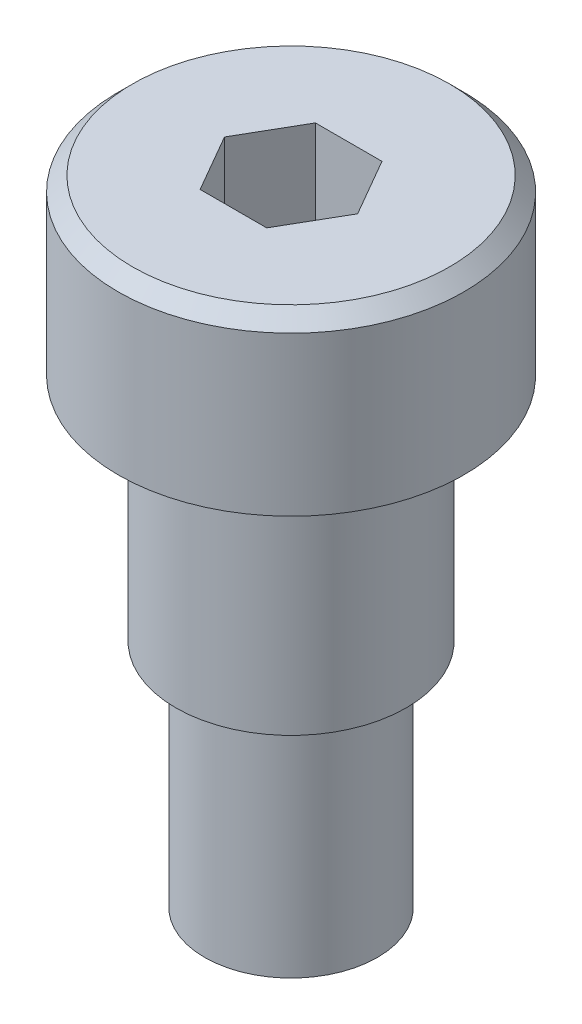
ISO-10303-21;
HEADER;
FILE_DESCRIPTION(('STEP AP214'),'2;1');
FILE_NAME('part.step','',(''),(''),'','','');
FILE_SCHEMA(('AUTOMOTIVE_DESIGN { 1 0 10303 214 1 1 1 1 }'));
ENDSEC;
DATA;
#1=APPLICATION_CONTEXT('core data for automotive mechanical design processes');
#2=APPLICATION_PROTOCOL_DEFINITION('international standard','automotive_design',2000,#1);
#3=PRODUCT_CONTEXT('',#1,'mechanical');
#4=PRODUCT('Part','Part','',(#3));
#5=PRODUCT_RELATED_PRODUCT_CATEGORY('part','',(#4));
#6=PRODUCT_DEFINITION_FORMATION('','',#4);
#7=PRODUCT_DEFINITION_CONTEXT('part definition',#1,'design');
#8=PRODUCT_DEFINITION('design','',#6,#7);
#9=PRODUCT_DEFINITION_SHAPE('','',#8);
#10=(LENGTH_UNIT() NAMED_UNIT(*) SI_UNIT(.MILLI.,.METRE.));
#11=(NAMED_UNIT(*) PLANE_ANGLE_UNIT() SI_UNIT($,.RADIAN.));
#12=(NAMED_UNIT(*) SI_UNIT($,.STERADIAN.) SOLID_ANGLE_UNIT());
#13=UNCERTAINTY_MEASURE_WITH_UNIT(LENGTH_MEASURE(1.E-05),#10,'distance_accuracy_value','');
#14=(GEOMETRIC_REPRESENTATION_CONTEXT(3) GLOBAL_UNCERTAINTY_ASSIGNED_CONTEXT((#13)) GLOBAL_UNIT_ASSIGNED_CONTEXT((#10,
#11,#12)) REPRESENTATION_CONTEXT('',''));
#15=CARTESIAN_POINT('',(0.,0.,0.));
#16=DIRECTION('',(0.,0.,1.));
#17=DIRECTION('',(1.,0.,0.));
#18=AXIS2_PLACEMENT_3D('',#15,#16,#17);
#19=CARTESIAN_POINT('',(0.,3.,0.));
#20=DIRECTION('',(0.,-1.,0.));
#21=DIRECTION('',(0.,0.,-1.));
#22=AXIS2_PLACEMENT_3D('',#19,#20,#21);
#23=CYLINDRICAL_SURFACE('',#22,3.);
#24=CARTESIAN_POINT('',(0.,2.75,0.));
#25=DIRECTION('',(0.,1.,0.));
#26=DIRECTION('',(0.,0.,1.));
#27=AXIS2_PLACEMENT_3D('',#24,#25,#26);
#28=CIRCLE('',#27,3.);
#29=CARTESIAN_POINT('',(0.,2.75,3.));
#30=VERTEX_POINT('',#29);
#31=EDGE_CURVE('E11',#30,#30,#28,.F.);
#32=ORIENTED_EDGE('',*,*,#31,.T.);
#33=EDGE_LOOP('',(#32));
#34=FACE_BOUND('',#33,.T.);
#35=CARTESIAN_POINT('',(0.,0.,0.));
#36=DIRECTION('',(0.,1.,0.));
#37=DIRECTION('',(0.,0.,1.));
#38=AXIS2_PLACEMENT_3D('',#35,#36,#37);
#39=CIRCLE('',#38,3.);
#40=CARTESIAN_POINT('',(0.,0.,3.));
#41=VERTEX_POINT('',#40);
#42=EDGE_CURVE('E159',#41,#41,#39,.T.);
#43=ORIENTED_EDGE('',*,*,#42,.T.);
#44=EDGE_LOOP('',(#43));
#45=FACE_BOUND('',#44,.T.);
#46=ADVANCED_FACE('F43',(#34,#45),#23,.T.);
#47=CARTESIAN_POINT('',(0.,3.,0.));
#48=DIRECTION('',(0.,1.,0.));
#49=DIRECTION('',(0.,0.,1.));
#50=AXIS2_PLACEMENT_3D('',#47,#48,#49);
#51=PLANE('',#50);
#52=CARTESIAN_POINT('',(0.,3.,0.));
#53=DIRECTION('',(0.,1.,0.));
#54=DIRECTION('',(0.,0.,1.));
#55=AXIS2_PLACEMENT_3D('',#52,#53,#54);
#56=CIRCLE('',#55,2.75);
#57=CARTESIAN_POINT('',(0.,3.,2.75));
#58=VERTEX_POINT('',#57);
#59=EDGE_CURVE('E51',#58,#58,#56,.T.);
#60=ORIENTED_EDGE('',*,*,#59,.T.);
#61=EDGE_LOOP('',(#60));
#62=FACE_BOUND('',#61,.T.);
#63=DIRECTION('',(-0.5,0.,-0.866025403784439));
#64=VECTOR('',#63,1.);
#65=CARTESIAN_POINT('',(1.15470053837925,3.,0.));
#66=LINE('',#65,#64);
#67=CARTESIAN_POINT('',(1.15470053837925,3.,0.));
#68=VERTEX_POINT('',#67);
#69=CARTESIAN_POINT('',(0.577350269189626,3.,-1.));
#70=VERTEX_POINT('',#69);
#71=EDGE_CURVE('E58',#68,#70,#66,.T.);
#72=ORIENTED_EDGE('',*,*,#71,.F.);
#73=DIRECTION('',(0.5,0.,-0.866025403784439));
#74=VECTOR('',#73,1.);
#75=CARTESIAN_POINT('',(0.577350269189626,3.,1.));
#76=LINE('',#75,#74);
#77=CARTESIAN_POINT('',(0.577350269189626,3.,1.));
#78=VERTEX_POINT('',#77);
#79=EDGE_CURVE('E141',#78,#68,#76,.T.);
#80=ORIENTED_EDGE('',*,*,#79,.F.);
#81=DIRECTION('',(1.,0.,0.));
#82=VECTOR('',#81,1.);
#83=CARTESIAN_POINT('',(-0.577350269189625,3.,1.));
#84=LINE('',#83,#82);
#85=CARTESIAN_POINT('',(-0.577350269189625,3.,1.));
#86=VERTEX_POINT('',#85);
#87=EDGE_CURVE('E139',#86,#78,#84,.T.);
#88=ORIENTED_EDGE('',*,*,#87,.F.);
#89=DIRECTION('',(0.5,0.,0.866025403784439));
#90=VECTOR('',#89,1.);
#91=CARTESIAN_POINT('',(-1.15470053837925,3.,0.));
#92=LINE('',#91,#90);
#93=CARTESIAN_POINT('',(-1.15470053837925,3.,0.));
#94=VERTEX_POINT('',#93);
#95=EDGE_CURVE('E106',#94,#86,#92,.T.);
#96=ORIENTED_EDGE('',*,*,#95,.F.);
#97=DIRECTION('',(-0.5,0.,0.866025403784439));
#98=VECTOR('',#97,1.);
#99=CARTESIAN_POINT('',(-0.577350269189626,3.,-1.));
#100=LINE('',#99,#98);
#101=CARTESIAN_POINT('',(-0.577350269189626,3.,-1.));
#102=VERTEX_POINT('',#101);
#103=EDGE_CURVE('E135',#102,#94,#100,.T.);
#104=ORIENTED_EDGE('',*,*,#103,.F.);
#105=DIRECTION('',(-1.,0.,0.));
#106=VECTOR('',#105,1.);
#107=CARTESIAN_POINT('',(0.577350269189626,3.,-1.));
#108=LINE('',#107,#106);
#109=EDGE_CURVE('E132',#70,#102,#108,.T.);
#110=ORIENTED_EDGE('',*,*,#109,.F.);
#111=EDGE_LOOP('',(#72,#80,#88,#96,#104,#110));
#112=FACE_BOUND('',#111,.T.);
#113=ADVANCED_FACE('F167',(#62,#112),#51,.T.);
#114=CARTESIAN_POINT('',(0.,0.,0.));
#115=DIRECTION('',(0.,1.,0.));
#116=DIRECTION('',(0.,0.,1.));
#117=AXIS2_PLACEMENT_3D('',#114,#115,#116);
#118=PLANE('',#117);
#119=CARTESIAN_POINT('',(0.,0.,0.));
#120=DIRECTION('',(0.,1.,0.));
#121=DIRECTION('',(0.,0.,1.));
#122=AXIS2_PLACEMENT_3D('',#119,#120,#121);
#123=CIRCLE('',#122,2.);
#124=CARTESIAN_POINT('',(0.,0.,2.));
#125=VERTEX_POINT('',#124);
#126=EDGE_CURVE('E162',#125,#125,#123,.F.);
#127=ORIENTED_EDGE('',*,*,#126,.F.);
#128=EDGE_LOOP('',(#127));
#129=FACE_BOUND('',#128,.T.);
#130=ORIENTED_EDGE('',*,*,#42,.F.);
#131=EDGE_LOOP('',(#130));
#132=FACE_BOUND('',#131,.T.);
#133=ADVANCED_FACE('F184',(#129,#132),#118,.F.);
#134=CARTESIAN_POINT('',(0.,-4.,0.));
#135=DIRECTION('',(0.,1.,0.));
#136=DIRECTION('',(0.,0.,1.));
#137=AXIS2_PLACEMENT_3D('',#134,#135,#136);
#138=CYLINDRICAL_SURFACE('',#137,2.);
#139=CARTESIAN_POINT('',(0.,-4.,0.));
#140=DIRECTION('',(0.,-1.,0.));
#141=DIRECTION('',(0.,0.,-1.));
#142=AXIS2_PLACEMENT_3D('',#139,#140,#141);
#143=CIRCLE('',#142,2.);
#144=CARTESIAN_POINT('',(0.,-4.,-2.));
#145=VERTEX_POINT('',#144);
#146=EDGE_CURVE('E154',#145,#145,#143,.T.);
#147=ORIENTED_EDGE('',*,*,#146,.F.);
#148=EDGE_LOOP('',(#147));
#149=FACE_BOUND('',#148,.T.);
#150=ORIENTED_EDGE('',*,*,#126,.T.);
#151=EDGE_LOOP('',(#150));
#152=FACE_BOUND('',#151,.T.);
#153=ADVANCED_FACE('F189',(#149,#152),#138,.T.);
#154=CARTESIAN_POINT('',(0.,-4.,0.));
#155=DIRECTION('',(0.,-1.,0.));
#156=DIRECTION('',(0.,0.,-1.));
#157=AXIS2_PLACEMENT_3D('',#154,#155,#156);
#158=PLANE('',#157);
#159=CARTESIAN_POINT('',(0.,-4.,0.));
#160=DIRECTION('',(0.,-1.,0.));
#161=DIRECTION('',(0.,0.,-1.));
#162=AXIS2_PLACEMENT_3D('',#159,#160,#161);
#163=CIRCLE('',#162,1.5);
#164=CARTESIAN_POINT('',(0.,-4.,-1.5));
#165=VERTEX_POINT('',#164);
#166=EDGE_CURVE('E145',#165,#165,#163,.T.);
#167=ORIENTED_EDGE('',*,*,#166,.F.);
#168=EDGE_LOOP('',(#167));
#169=FACE_BOUND('',#168,.T.);
#170=ORIENTED_EDGE('',*,*,#146,.T.);
#171=EDGE_LOOP('',(#170));
#172=FACE_BOUND('',#171,.T.);
#173=ADVANCED_FACE('F194',(#169,#172),#158,.T.);
#174=CARTESIAN_POINT('',(0.,-8.,0.));
#175=DIRECTION('',(0.,1.,0.));
#176=DIRECTION('',(0.,0.,1.));
#177=AXIS2_PLACEMENT_3D('',#174,#175,#176);
#178=CYLINDRICAL_SURFACE('',#177,1.5);
#179=CARTESIAN_POINT('',(0.,-8.,0.));
#180=DIRECTION('',(0.,-1.,0.));
#181=DIRECTION('',(0.,0.,-1.));
#182=AXIS2_PLACEMENT_3D('',#179,#180,#181);
#183=CIRCLE('',#182,1.5);
#184=CARTESIAN_POINT('',(0.,-8.,-1.5));
#185=VERTEX_POINT('',#184);
#186=EDGE_CURVE('E151',#185,#185,#183,.T.);
#187=ORIENTED_EDGE('',*,*,#186,.F.);
#188=EDGE_LOOP('',(#187));
#189=FACE_BOUND('',#188,.T.);
#190=ORIENTED_EDGE('',*,*,#166,.T.);
#191=EDGE_LOOP('',(#190));
#192=FACE_BOUND('',#191,.T.);
#193=ADVANCED_FACE('F198',(#189,#192),#178,.T.);
#194=CARTESIAN_POINT('',(0.,-8.,0.));
#195=DIRECTION('',(0.,-1.,0.));
#196=DIRECTION('',(0.,0.,-1.));
#197=AXIS2_PLACEMENT_3D('',#194,#195,#196);
#198=PLANE('',#197);
#199=ORIENTED_EDGE('',*,*,#186,.T.);
#200=EDGE_LOOP('',(#199));
#201=FACE_BOUND('',#200,.T.);
#202=ADVANCED_FACE('F202',(#201),#198,.T.);
#203=CARTESIAN_POINT('',(1.15470053837925,1.,0.));
#204=DIRECTION('',(0.866025403784439,0.,-0.5));
#205=DIRECTION('',(-0.5,0.,-0.866025403784439));
#206=AXIS2_PLACEMENT_3D('',#203,#204,#205);
#207=PLANE('',#206);
#208=ORIENTED_EDGE('',*,*,#71,.T.);
#209=DIRECTION('',(0.,1.,0.));
#210=VECTOR('',#209,1.);
#211=CARTESIAN_POINT('',(0.577350269189626,1.,-1.));
#212=LINE('',#211,#210);
#213=CARTESIAN_POINT('',(0.577350269189626,1.,-1.));
#214=VERTEX_POINT('',#213);
#215=EDGE_CURVE('E88',#214,#70,#212,.T.);
#216=ORIENTED_EDGE('',*,*,#215,.F.);
#217=DIRECTION('',(-0.5,0.,-0.866025403784439));
#218=VECTOR('',#217,1.);
#219=CARTESIAN_POINT('',(1.15470053837925,1.,0.));
#220=LINE('',#219,#218);
#221=CARTESIAN_POINT('',(1.15470053837925,1.,0.));
#222=VERTEX_POINT('',#221);
#223=EDGE_CURVE('E143',#222,#214,#220,.T.);
#224=ORIENTED_EDGE('',*,*,#223,.F.);
#225=DIRECTION('',(0.,1.,0.));
#226=VECTOR('',#225,1.);
#227=CARTESIAN_POINT('',(1.15470053837925,1.,0.));
#228=LINE('',#227,#226);
#229=EDGE_CURVE('E66',#222,#68,#228,.T.);
#230=ORIENTED_EDGE('',*,*,#229,.T.);
#231=EDGE_LOOP('',(#208,#216,#224,#230));
#232=FACE_BOUND('',#231,.T.);
#233=ADVANCED_FACE('F206',(#232),#207,.F.);
#234=CARTESIAN_POINT('',(0.577350269189626,1.,1.));
#235=DIRECTION('',(0.866025403784439,0.,0.5));
#236=DIRECTION('',(0.5,0.,-0.866025403784439));
#237=AXIS2_PLACEMENT_3D('',#234,#235,#236);
#238=PLANE('',#237);
#239=ORIENTED_EDGE('',*,*,#79,.T.);
#240=ORIENTED_EDGE('',*,*,#229,.F.);
#241=DIRECTION('',(0.5,0.,-0.866025403784439));
#242=VECTOR('',#241,1.);
#243=CARTESIAN_POINT('',(0.577350269189626,1.,1.));
#244=LINE('',#243,#242);
#245=CARTESIAN_POINT('',(0.577350269189626,1.,1.));
#246=VERTEX_POINT('',#245);
#247=EDGE_CURVE('E118',#246,#222,#244,.T.);
#248=ORIENTED_EDGE('',*,*,#247,.F.);
#249=DIRECTION('',(0.,1.,0.));
#250=VECTOR('',#249,1.);
#251=CARTESIAN_POINT('',(0.577350269189626,1.,1.));
#252=LINE('',#251,#250);
#253=EDGE_CURVE('E110',#246,#78,#252,.T.);
#254=ORIENTED_EDGE('',*,*,#253,.T.);
#255=EDGE_LOOP('',(#239,#240,#248,#254));
#256=FACE_BOUND('',#255,.T.);
#257=ADVANCED_FACE('F210',(#256),#238,.F.);
#258=CARTESIAN_POINT('',(-0.577350269189625,1.,1.));
#259=DIRECTION('',(0.,0.,1.));
#260=DIRECTION('',(1.,0.,0.));
#261=AXIS2_PLACEMENT_3D('',#258,#259,#260);
#262=PLANE('',#261);
#263=ORIENTED_EDGE('',*,*,#87,.T.);
#264=ORIENTED_EDGE('',*,*,#253,.F.);
#265=DIRECTION('',(1.,0.,0.));
#266=VECTOR('',#265,1.);
#267=CARTESIAN_POINT('',(-0.577350269189625,1.,1.));
#268=LINE('',#267,#266);
#269=CARTESIAN_POINT('',(-0.577350269189625,1.,1.));
#270=VERTEX_POINT('',#269);
#271=EDGE_CURVE('E114',#270,#246,#268,.T.);
#272=ORIENTED_EDGE('',*,*,#271,.F.);
#273=DIRECTION('',(0.,1.,0.));
#274=VECTOR('',#273,1.);
#275=CARTESIAN_POINT('',(-0.577350269189625,1.,1.));
#276=LINE('',#275,#274);
#277=EDGE_CURVE('E99',#270,#86,#276,.T.);
#278=ORIENTED_EDGE('',*,*,#277,.T.);
#279=EDGE_LOOP('',(#263,#264,#272,#278));
#280=FACE_BOUND('',#279,.T.);
#281=ADVANCED_FACE('F115',(#280),#262,.F.);
#282=CARTESIAN_POINT('',(-1.15470053837925,1.,0.));
#283=DIRECTION('',(-0.866025403784439,0.,0.5));
#284=DIRECTION('',(0.5,0.,0.866025403784439));
#285=AXIS2_PLACEMENT_3D('',#282,#283,#284);
#286=PLANE('',#285);
#287=ORIENTED_EDGE('',*,*,#95,.T.);
#288=ORIENTED_EDGE('',*,*,#277,.F.);
#289=DIRECTION('',(0.5,0.,0.866025403784439));
#290=VECTOR('',#289,1.);
#291=CARTESIAN_POINT('',(-1.15470053837925,1.,0.));
#292=LINE('',#291,#290);
#293=CARTESIAN_POINT('',(-1.15470053837925,1.,0.));
#294=VERTEX_POINT('',#293);
#295=EDGE_CURVE('E103',#294,#270,#292,.T.);
#296=ORIENTED_EDGE('',*,*,#295,.F.);
#297=DIRECTION('',(0.,1.,0.));
#298=VECTOR('',#297,1.);
#299=CARTESIAN_POINT('',(-1.15470053837925,1.,0.));
#300=LINE('',#299,#298);
#301=EDGE_CURVE('E111',#294,#94,#300,.T.);
#302=ORIENTED_EDGE('',*,*,#301,.T.);
#303=EDGE_LOOP('',(#287,#288,#296,#302));
#304=FACE_BOUND('',#303,.T.);
#305=ADVANCED_FACE('F101',(#304),#286,.F.);
#306=CARTESIAN_POINT('',(-0.577350269189626,1.,-1.));
#307=DIRECTION('',(-0.866025403784439,0.,-0.5));
#308=DIRECTION('',(-0.5,0.,0.866025403784439));
#309=AXIS2_PLACEMENT_3D('',#306,#307,#308);
#310=PLANE('',#309);
#311=ORIENTED_EDGE('',*,*,#103,.T.);
#312=ORIENTED_EDGE('',*,*,#301,.F.);
#313=DIRECTION('',(-0.5,0.,0.866025403784439));
#314=VECTOR('',#313,1.);
#315=CARTESIAN_POINT('',(-0.577350269189626,1.,-1.));
#316=LINE('',#315,#314);
#317=CARTESIAN_POINT('',(-0.577350269189626,1.,-1.));
#318=VERTEX_POINT('',#317);
#319=EDGE_CURVE('E124',#318,#294,#316,.T.);
#320=ORIENTED_EDGE('',*,*,#319,.F.);
#321=DIRECTION('',(0.,1.,0.));
#322=VECTOR('',#321,1.);
#323=CARTESIAN_POINT('',(-0.577350269189626,1.,-1.));
#324=LINE('',#323,#322);
#325=EDGE_CURVE('E148',#318,#102,#324,.T.);
#326=ORIENTED_EDGE('',*,*,#325,.T.);
#327=EDGE_LOOP('',(#311,#312,#320,#326));
#328=FACE_BOUND('',#327,.T.);
#329=ADVANCED_FACE('F213',(#328),#310,.F.);
#330=CARTESIAN_POINT('',(0.577350269189626,1.,-1.));
#331=DIRECTION('',(0.,0.,-1.));
#332=DIRECTION('',(-1.,0.,0.));
#333=AXIS2_PLACEMENT_3D('',#330,#331,#332);
#334=PLANE('',#333);
#335=ORIENTED_EDGE('',*,*,#109,.T.);
#336=ORIENTED_EDGE('',*,*,#325,.F.);
#337=DIRECTION('',(-1.,0.,0.));
#338=VECTOR('',#337,1.);
#339=CARTESIAN_POINT('',(0.577350269189626,1.,-1.));
#340=LINE('',#339,#338);
#341=EDGE_CURVE('E126',#214,#318,#340,.T.);
#342=ORIENTED_EDGE('',*,*,#341,.F.);
#343=ORIENTED_EDGE('',*,*,#215,.T.);
#344=EDGE_LOOP('',(#335,#336,#342,#343));
#345=FACE_BOUND('',#344,.T.);
#346=ADVANCED_FACE('F175',(#345),#334,.F.);
#347=CARTESIAN_POINT('',(0.,1.,0.));
#348=DIRECTION('',(0.,1.,0.));
#349=DIRECTION('',(0.,0.,1.));
#350=AXIS2_PLACEMENT_3D('',#347,#348,#349);
#351=PLANE('',#350);
#352=ORIENTED_EDGE('',*,*,#223,.T.);
#353=ORIENTED_EDGE('',*,*,#341,.T.);
#354=ORIENTED_EDGE('',*,*,#319,.T.);
#355=ORIENTED_EDGE('',*,*,#295,.T.);
#356=ORIENTED_EDGE('',*,*,#271,.T.);
#357=ORIENTED_EDGE('',*,*,#247,.T.);
#358=EDGE_LOOP('',(#352,#353,#354,#355,#356,#357));
#359=FACE_BOUND('',#358,.T.);
#360=ADVANCED_FACE('F121',(#359),#351,.T.);
#361=CARTESIAN_POINT('',(0.,3.,0.));
#362=DIRECTION('',(0.,-1.,0.));
#363=DIRECTION('',(0.,0.,-1.));
#364=AXIS2_PLACEMENT_3D('',#361,#362,#363);
#365=CONICAL_SURFACE('',#364,2.75,0.785398163397447);
#366=ORIENTED_EDGE('',*,*,#31,.F.);
#367=EDGE_LOOP('',(#366));
#368=FACE_BOUND('',#367,.T.);
#369=ORIENTED_EDGE('',*,*,#59,.F.);
#370=EDGE_LOOP('',(#369));
#371=FACE_BOUND('',#370,.T.);
#372=ADVANCED_FACE('F45',(#368,#371),#365,.T.);
#373=CLOSED_SHELL('',(#46,#113,#133,#153,#173,#193,#202,#233,#257,#281,#305,#329,#346,#360,#372));
#374=MANIFOLD_SOLID_BREP('B2',#373);
#375=ADVANCED_BREP_SHAPE_REPRESENTATION('',(#18,#374),#14);
#376=SHAPE_DEFINITION_REPRESENTATION(#9,#375);
ENDSEC;
END-ISO-10303-21;
